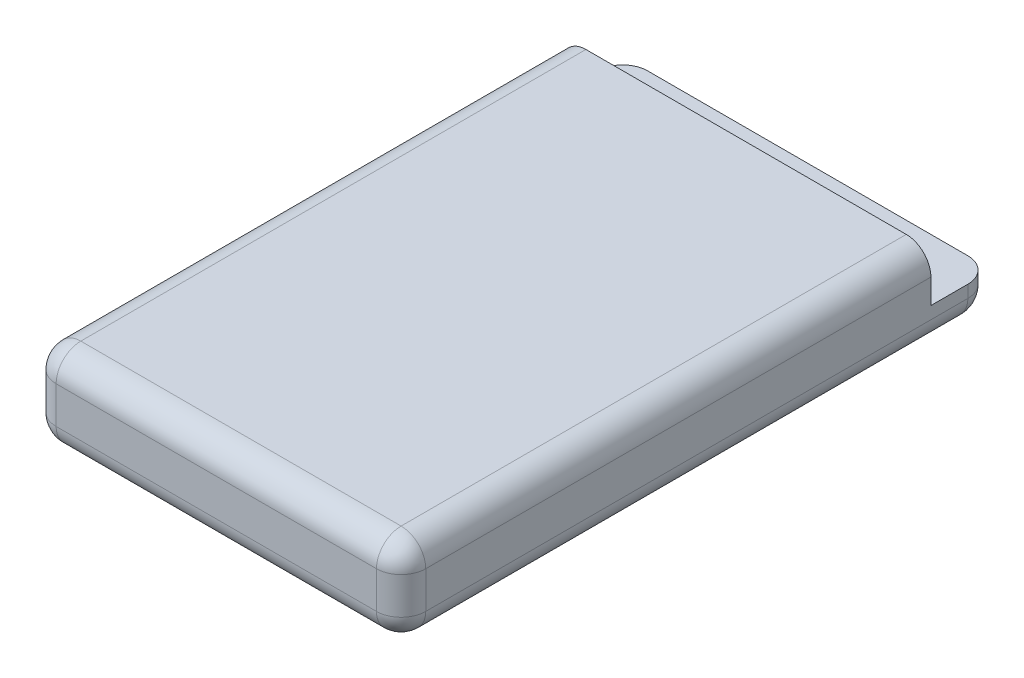
ISO-10303-21;
HEADER;
FILE_DESCRIPTION(('STEP AP214'),'2;1');
FILE_NAME('part.step','',(''),(''),'','','');
FILE_SCHEMA(('AUTOMOTIVE_DESIGN { 1 0 10303 214 1 1 1 1 }'));
ENDSEC;
DATA;
#1=APPLICATION_CONTEXT('core data for automotive mechanical design processes');
#2=APPLICATION_PROTOCOL_DEFINITION('international standard','automotive_design',2000,#1);
#3=PRODUCT_CONTEXT('',#1,'mechanical');
#4=PRODUCT('Part','Part','',(#3));
#5=PRODUCT_RELATED_PRODUCT_CATEGORY('part','',(#4));
#6=PRODUCT_DEFINITION_FORMATION('','',#4);
#7=PRODUCT_DEFINITION_CONTEXT('part definition',#1,'design');
#8=PRODUCT_DEFINITION('design','',#6,#7);
#9=PRODUCT_DEFINITION_SHAPE('','',#8);
#10=(LENGTH_UNIT() NAMED_UNIT(*) SI_UNIT(.MILLI.,.METRE.));
#11=(NAMED_UNIT(*) PLANE_ANGLE_UNIT() SI_UNIT($,.RADIAN.));
#12=(NAMED_UNIT(*) SI_UNIT($,.STERADIAN.) SOLID_ANGLE_UNIT());
#13=UNCERTAINTY_MEASURE_WITH_UNIT(LENGTH_MEASURE(1.E-05),#10,'distance_accuracy_value','');
#14=(GEOMETRIC_REPRESENTATION_CONTEXT(3) GLOBAL_UNCERTAINTY_ASSIGNED_CONTEXT((#13)) GLOBAL_UNIT_ASSIGNED_CONTEXT((#10,
#11,#12)) REPRESENTATION_CONTEXT('',''));
#15=CARTESIAN_POINT('',(0.,0.,0.));
#16=DIRECTION('',(0.,0.,1.));
#17=DIRECTION('',(1.,0.,0.));
#18=AXIS2_PLACEMENT_3D('',#15,#16,#17);
#19=CARTESIAN_POINT('',(-15.,7.,-24.));
#20=DIRECTION('',(0.,0.,1.));
#21=DIRECTION('',(1.,0.,0.));
#22=AXIS2_PLACEMENT_3D('',#19,#20,#21);
#23=PLANE('',#22);
#24=DIRECTION('',(1.,0.,0.));
#25=VECTOR('',#24,1.);
#26=CARTESIAN_POINT('',(0.,3.,-24.));
#27=LINE('',#26,#25);
#28=CARTESIAN_POINT('',(-13.,3.,-24.));
#29=VERTEX_POINT('',#28);
#30=CARTESIAN_POINT('',(13.,3.,-24.));
#31=VERTEX_POINT('',#30);
#32=EDGE_CURVE('E57',#29,#31,#27,.T.);
#33=ORIENTED_EDGE('',*,*,#32,.T.);
#34=DIRECTION('',(0.,-1.,0.));
#35=VECTOR('',#34,1.);
#36=CARTESIAN_POINT('',(13.,7.,-24.));
#37=LINE('',#36,#35);
#38=CARTESIAN_POINT('',(13.,2.,-24.));
#39=VERTEX_POINT('',#38);
#40=EDGE_CURVE('E156',#31,#39,#37,.T.);
#41=ORIENTED_EDGE('',*,*,#40,.T.);
#42=DIRECTION('',(-1.,0.,0.));
#43=VECTOR('',#42,1.);
#44=CARTESIAN_POINT('',(-15.,2.,-24.));
#45=LINE('',#44,#43);
#46=CARTESIAN_POINT('',(-13.,2.,-24.));
#47=VERTEX_POINT('',#46);
#48=EDGE_CURVE('E184',#39,#47,#45,.T.);
#49=ORIENTED_EDGE('',*,*,#48,.T.);
#50=DIRECTION('',(0.,-1.,0.));
#51=VECTOR('',#50,1.);
#52=CARTESIAN_POINT('',(-13.,7.,-24.));
#53=LINE('',#52,#51);
#54=EDGE_CURVE('E159',#47,#29,#53,.F.);
#55=ORIENTED_EDGE('',*,*,#54,.T.);
#56=EDGE_LOOP('',(#33,#41,#49,#55));
#57=FACE_BOUND('',#56,.T.);
#58=ADVANCED_FACE('F42',(#57),#23,.F.);
#59=CARTESIAN_POINT('',(13.,7.,-22.));
#60=DIRECTION('',(0.,-1.,0.));
#61=DIRECTION('',(0.,0.,-1.));
#62=AXIS2_PLACEMENT_3D('',#59,#60,#61);
#63=CYLINDRICAL_SURFACE('',#62,2.);
#64=ORIENTED_EDGE('',*,*,#40,.F.);
#65=CARTESIAN_POINT('',(13.,3.,-22.));
#66=DIRECTION('',(0.,1.,0.));
#67=DIRECTION('',(0.,0.,1.));
#68=AXIS2_PLACEMENT_3D('',#65,#66,#67);
#69=CIRCLE('',#68,2.);
#70=CARTESIAN_POINT('',(15.,3.,-22.));
#71=VERTEX_POINT('',#70);
#72=EDGE_CURVE('E142',#31,#71,#69,.F.);
#73=ORIENTED_EDGE('',*,*,#72,.T.);
#74=DIRECTION('',(0.,-1.,0.));
#75=VECTOR('',#74,1.);
#76=CARTESIAN_POINT('',(15.,7.,-22.));
#77=LINE('',#76,#75);
#78=CARTESIAN_POINT('',(15.,2.,-22.));
#79=VERTEX_POINT('',#78);
#80=EDGE_CURVE('E168',#79,#71,#77,.F.);
#81=ORIENTED_EDGE('',*,*,#80,.F.);
#82=CARTESIAN_POINT('',(13.,2.,-22.));
#83=DIRECTION('',(0.,1.,0.));
#84=DIRECTION('',(0.,0.,1.));
#85=AXIS2_PLACEMENT_3D('',#82,#83,#84);
#86=CIRCLE('',#85,2.);
#87=EDGE_CURVE('E165',#79,#39,#86,.T.);
#88=ORIENTED_EDGE('',*,*,#87,.T.);
#89=EDGE_LOOP('',(#64,#73,#81,#88));
#90=FACE_BOUND('',#89,.T.);
#91=ADVANCED_FACE('F163',(#90),#63,.T.);
#92=CARTESIAN_POINT('',(-13.,7.,-22.));
#93=DIRECTION('',(0.,-1.,0.));
#94=DIRECTION('',(0.,0.,-1.));
#95=AXIS2_PLACEMENT_3D('',#92,#93,#94);
#96=CYLINDRICAL_SURFACE('',#95,2.);
#97=DIRECTION('',(0.,-1.,0.));
#98=VECTOR('',#97,1.);
#99=CARTESIAN_POINT('',(-15.,7.,-22.));
#100=LINE('',#99,#98);
#101=CARTESIAN_POINT('',(-15.,3.,-22.));
#102=VERTEX_POINT('',#101);
#103=CARTESIAN_POINT('',(-15.,2.,-22.));
#104=VERTEX_POINT('',#103);
#105=EDGE_CURVE('E181',#102,#104,#100,.T.);
#106=ORIENTED_EDGE('',*,*,#105,.F.);
#107=CARTESIAN_POINT('',(-13.,3.,-22.));
#108=DIRECTION('',(0.,1.,0.));
#109=DIRECTION('',(0.,0.,1.));
#110=AXIS2_PLACEMENT_3D('',#107,#108,#109);
#111=CIRCLE('',#110,2.);
#112=EDGE_CURVE('E50',#102,#29,#111,.F.);
#113=ORIENTED_EDGE('',*,*,#112,.T.);
#114=ORIENTED_EDGE('',*,*,#54,.F.);
#115=CARTESIAN_POINT('',(-13.,2.,-22.));
#116=DIRECTION('',(0.,1.,0.));
#117=DIRECTION('',(0.,0.,1.));
#118=AXIS2_PLACEMENT_3D('',#115,#116,#117);
#119=CIRCLE('',#118,2.);
#120=EDGE_CURVE('E189',#47,#104,#119,.T.);
#121=ORIENTED_EDGE('',*,*,#120,.T.);
#122=EDGE_LOOP('',(#106,#113,#114,#121));
#123=FACE_BOUND('',#122,.T.);
#124=ADVANCED_FACE('F201',(#123),#96,.T.);
#125=CARTESIAN_POINT('',(15.,7.,24.));
#126=DIRECTION('',(-1.,0.,0.));
#127=DIRECTION('',(0.,0.,1.));
#128=AXIS2_PLACEMENT_3D('',#125,#126,#127);
#129=PLANE('',#128);
#130=DIRECTION('',(0.,0.,-1.));
#131=VECTOR('',#130,1.);
#132=CARTESIAN_POINT('',(15.,3.,24.));
#133=LINE('',#132,#131);
#134=CARTESIAN_POINT('',(15.,3.,-19.));
#135=VERTEX_POINT('',#134);
#136=EDGE_CURVE('E146',#135,#71,#133,.T.);
#137=ORIENTED_EDGE('',*,*,#136,.F.);
#138=DIRECTION('',(0.,1.,0.));
#139=VECTOR('',#138,1.);
#140=CARTESIAN_POINT('',(15.,7.,-19.));
#141=LINE('',#140,#139);
#142=CARTESIAN_POINT('',(15.,5.,-19.));
#143=VERTEX_POINT('',#142);
#144=EDGE_CURVE('E213',#135,#143,#141,.T.);
#145=ORIENTED_EDGE('',*,*,#144,.T.);
#146=DIRECTION('',(0.,0.,-1.));
#147=VECTOR('',#146,1.);
#148=CARTESIAN_POINT('',(15.,5.,24.));
#149=LINE('',#148,#147);
#150=CARTESIAN_POINT('',(15.,5.,22.));
#151=VERTEX_POINT('',#150);
#152=EDGE_CURVE('E242',#143,#151,#149,.F.);
#153=ORIENTED_EDGE('',*,*,#152,.T.);
#154=DIRECTION('',(0.,-1.,0.));
#155=VECTOR('',#154,1.);
#156=CARTESIAN_POINT('',(15.,7.,22.));
#157=LINE('',#156,#155);
#158=CARTESIAN_POINT('',(15.,2.,22.));
#159=VERTEX_POINT('',#158);
#160=EDGE_CURVE('E166',#151,#159,#157,.T.);
#161=ORIENTED_EDGE('',*,*,#160,.T.);
#162=DIRECTION('',(0.,0.,-1.));
#163=VECTOR('',#162,1.);
#164=CARTESIAN_POINT('',(15.,2.,-24.));
#165=LINE('',#164,#163);
#166=EDGE_CURVE('E244',#159,#79,#165,.T.);
#167=ORIENTED_EDGE('',*,*,#166,.T.);
#168=ORIENTED_EDGE('',*,*,#80,.T.);
#169=EDGE_LOOP('',(#137,#145,#153,#161,#167,#168));
#170=FACE_BOUND('',#169,.T.);
#171=ADVANCED_FACE('F317',(#170),#129,.F.);
#172=CARTESIAN_POINT('',(-15.,7.,24.));
#173=DIRECTION('',(1.,0.,0.));
#174=DIRECTION('',(0.,0.,-1.));
#175=AXIS2_PLACEMENT_3D('',#172,#173,#174);
#176=PLANE('',#175);
#177=DIRECTION('',(0.,0.,1.));
#178=VECTOR('',#177,1.);
#179=CARTESIAN_POINT('',(-15.,5.,24.));
#180=LINE('',#179,#178);
#181=CARTESIAN_POINT('',(-15.,5.,22.));
#182=VERTEX_POINT('',#181);
#183=CARTESIAN_POINT('',(-15.,5.,-19.));
#184=VERTEX_POINT('',#183);
#185=EDGE_CURVE('E232',#182,#184,#180,.F.);
#186=ORIENTED_EDGE('',*,*,#185,.T.);
#187=DIRECTION('',(0.,-1.,0.));
#188=VECTOR('',#187,1.);
#189=CARTESIAN_POINT('',(-15.,7.,-19.));
#190=LINE('',#189,#188);
#191=CARTESIAN_POINT('',(-15.,3.,-19.));
#192=VERTEX_POINT('',#191);
#193=EDGE_CURVE('E197',#184,#192,#190,.T.);
#194=ORIENTED_EDGE('',*,*,#193,.T.);
#195=DIRECTION('',(0.,0.,1.));
#196=VECTOR('',#195,1.);
#197=CARTESIAN_POINT('',(-15.,3.,24.));
#198=LINE('',#197,#196);
#199=EDGE_CURVE('E151',#102,#192,#198,.T.);
#200=ORIENTED_EDGE('',*,*,#199,.F.);
#201=ORIENTED_EDGE('',*,*,#105,.T.);
#202=DIRECTION('',(0.,0.,1.));
#203=VECTOR('',#202,1.);
#204=CARTESIAN_POINT('',(-15.,2.,24.));
#205=LINE('',#204,#203);
#206=CARTESIAN_POINT('',(-15.,2.,22.));
#207=VERTEX_POINT('',#206);
#208=EDGE_CURVE('E234',#104,#207,#205,.T.);
#209=ORIENTED_EDGE('',*,*,#208,.T.);
#210=DIRECTION('',(0.,-1.,0.));
#211=VECTOR('',#210,1.);
#212=CARTESIAN_POINT('',(-15.,7.,22.));
#213=LINE('',#212,#211);
#214=EDGE_CURVE('E179',#207,#182,#213,.F.);
#215=ORIENTED_EDGE('',*,*,#214,.T.);
#216=EDGE_LOOP('',(#186,#194,#200,#201,#209,#215));
#217=FACE_BOUND('',#216,.T.);
#218=ADVANCED_FACE('F207',(#217),#176,.F.);
#219=CARTESIAN_POINT('',(-15.,7.,24.));
#220=DIRECTION('',(0.,0.,-1.));
#221=DIRECTION('',(-1.,0.,0.));
#222=AXIS2_PLACEMENT_3D('',#219,#220,#221);
#223=PLANE('',#222);
#224=DIRECTION('',(1.,0.,0.));
#225=VECTOR('',#224,1.);
#226=CARTESIAN_POINT('',(15.,2.,24.));
#227=LINE('',#226,#225);
#228=CARTESIAN_POINT('',(-13.,2.,24.));
#229=VERTEX_POINT('',#228);
#230=CARTESIAN_POINT('',(13.,2.,24.));
#231=VERTEX_POINT('',#230);
#232=EDGE_CURVE('E239',#229,#231,#227,.T.);
#233=ORIENTED_EDGE('',*,*,#232,.T.);
#234=DIRECTION('',(0.,-1.,0.));
#235=VECTOR('',#234,1.);
#236=CARTESIAN_POINT('',(13.,7.,24.));
#237=LINE('',#236,#235);
#238=CARTESIAN_POINT('',(13.,5.,24.));
#239=VERTEX_POINT('',#238);
#240=EDGE_CURVE('E177',#231,#239,#237,.F.);
#241=ORIENTED_EDGE('',*,*,#240,.T.);
#242=DIRECTION('',(1.,0.,0.));
#243=VECTOR('',#242,1.);
#244=CARTESIAN_POINT('',(-15.,5.,24.));
#245=LINE('',#244,#243);
#246=CARTESIAN_POINT('',(-13.,5.,24.));
#247=VERTEX_POINT('',#246);
#248=EDGE_CURVE('E236',#239,#247,#245,.F.);
#249=ORIENTED_EDGE('',*,*,#248,.T.);
#250=DIRECTION('',(0.,-1.,0.));
#251=VECTOR('',#250,1.);
#252=CARTESIAN_POINT('',(-13.,7.,24.));
#253=LINE('',#252,#251);
#254=EDGE_CURVE('E175',#247,#229,#253,.T.);
#255=ORIENTED_EDGE('',*,*,#254,.T.);
#256=EDGE_LOOP('',(#233,#241,#249,#255));
#257=FACE_BOUND('',#256,.T.);
#258=ADVANCED_FACE('F370',(#257),#223,.F.);
#259=CARTESIAN_POINT('',(0.,7.,0.));
#260=DIRECTION('',(0.,-1.,0.));
#261=DIRECTION('',(0.,0.,-1.));
#262=AXIS2_PLACEMENT_3D('',#259,#260,#261);
#263=PLANE('',#262);
#264=DIRECTION('',(0.,0.,-1.));
#265=VECTOR('',#264,1.);
#266=CARTESIAN_POINT('',(13.,7.,0.));
#267=LINE('',#266,#265);
#268=CARTESIAN_POINT('',(13.,7.,22.));
#269=VERTEX_POINT('',#268);
#270=CARTESIAN_POINT('',(13.,7.,-19.));
#271=VERTEX_POINT('',#270);
#272=EDGE_CURVE('E247',#269,#271,#267,.T.);
#273=ORIENTED_EDGE('',*,*,#272,.T.);
#274=DIRECTION('',(1.,0.,0.));
#275=VECTOR('',#274,1.);
#276=CARTESIAN_POINT('',(0.,7.,-19.));
#277=LINE('',#276,#275);
#278=CARTESIAN_POINT('',(-13.,7.,-19.));
#279=VERTEX_POINT('',#278);
#280=EDGE_CURVE('E210',#279,#271,#277,.T.);
#281=ORIENTED_EDGE('',*,*,#280,.F.);
#282=DIRECTION('',(0.,0.,1.));
#283=VECTOR('',#282,1.);
#284=CARTESIAN_POINT('',(-13.,7.,0.));
#285=LINE('',#284,#283);
#286=CARTESIAN_POINT('',(-13.,7.,22.));
#287=VERTEX_POINT('',#286);
#288=EDGE_CURVE('E250',#279,#287,#285,.T.);
#289=ORIENTED_EDGE('',*,*,#288,.T.);
#290=DIRECTION('',(1.,0.,0.));
#291=VECTOR('',#290,1.);
#292=CARTESIAN_POINT('',(0.,7.,22.));
#293=LINE('',#292,#291);
#294=EDGE_CURVE('E252',#287,#269,#293,.T.);
#295=ORIENTED_EDGE('',*,*,#294,.T.);
#296=EDGE_LOOP('',(#273,#281,#289,#295));
#297=FACE_BOUND('',#296,.T.);
#298=ADVANCED_FACE('F377',(#297),#263,.F.);
#299=CARTESIAN_POINT('',(0.,0.,0.));
#300=DIRECTION('',(0.,-1.,0.));
#301=DIRECTION('',(0.,0.,-1.));
#302=AXIS2_PLACEMENT_3D('',#299,#300,#301);
#303=PLANE('',#302);
#304=DIRECTION('',(0.,0.,1.));
#305=VECTOR('',#304,1.);
#306=CARTESIAN_POINT('',(-13.,0.,-24.));
#307=LINE('',#306,#305);
#308=CARTESIAN_POINT('',(-13.,0.,22.));
#309=VERTEX_POINT('',#308);
#310=CARTESIAN_POINT('',(-13.,0.,-22.));
#311=VERTEX_POINT('',#310);
#312=EDGE_CURVE('E226',#309,#311,#307,.F.);
#313=ORIENTED_EDGE('',*,*,#312,.T.);
#314=DIRECTION('',(-1.,0.,0.));
#315=VECTOR('',#314,1.);
#316=CARTESIAN_POINT('',(15.,0.,-22.));
#317=LINE('',#316,#315);
#318=CARTESIAN_POINT('',(13.,0.,-22.));
#319=VERTEX_POINT('',#318);
#320=EDGE_CURVE('E229',#311,#319,#317,.F.);
#321=ORIENTED_EDGE('',*,*,#320,.T.);
#322=DIRECTION('',(0.,0.,-1.));
#323=VECTOR('',#322,1.);
#324=CARTESIAN_POINT('',(13.,0.,24.));
#325=LINE('',#324,#323);
#326=CARTESIAN_POINT('',(13.,0.,22.));
#327=VERTEX_POINT('',#326);
#328=EDGE_CURVE('E220',#319,#327,#325,.F.);
#329=ORIENTED_EDGE('',*,*,#328,.T.);
#330=DIRECTION('',(1.,0.,0.));
#331=VECTOR('',#330,1.);
#332=CARTESIAN_POINT('',(-15.,0.,22.));
#333=LINE('',#332,#331);
#334=EDGE_CURVE('E223',#327,#309,#333,.F.);
#335=ORIENTED_EDGE('',*,*,#334,.T.);
#336=EDGE_LOOP('',(#313,#321,#329,#335));
#337=FACE_BOUND('',#336,.T.);
#338=ADVANCED_FACE('F286',(#337),#303,.T.);
#339=CARTESIAN_POINT('',(-15.,2.,22.));
#340=DIRECTION('',(-1.,0.,0.));
#341=DIRECTION('',(0.,0.,1.));
#342=AXIS2_PLACEMENT_3D('',#339,#340,#341);
#343=CYLINDRICAL_SURFACE('',#342,2.);
#344=ORIENTED_EDGE('',*,*,#334,.F.);
#345=CARTESIAN_POINT('',(13.,2.,22.));
#346=DIRECTION('',(-1.,0.,0.));
#347=DIRECTION('',(0.,0.,1.));
#348=AXIS2_PLACEMENT_3D('',#345,#346,#347);
#349=CIRCLE('',#348,2.);
#350=EDGE_CURVE('E274',#327,#231,#349,.T.);
#351=ORIENTED_EDGE('',*,*,#350,.T.);
#352=ORIENTED_EDGE('',*,*,#232,.F.);
#353=CARTESIAN_POINT('',(-13.,2.,22.));
#354=DIRECTION('',(-1.,0.,0.));
#355=DIRECTION('',(0.,0.,1.));
#356=AXIS2_PLACEMENT_3D('',#353,#354,#355);
#357=CIRCLE('',#356,2.);
#358=EDGE_CURVE('E272',#229,#309,#357,.F.);
#359=ORIENTED_EDGE('',*,*,#358,.T.);
#360=EDGE_LOOP('',(#344,#351,#352,#359));
#361=FACE_BOUND('',#360,.T.);
#362=ADVANCED_FACE('F329',(#361),#343,.T.);
#363=CARTESIAN_POINT('',(13.,2.,24.));
#364=DIRECTION('',(0.,0.,1.));
#365=DIRECTION('',(1.,0.,0.));
#366=AXIS2_PLACEMENT_3D('',#363,#364,#365);
#367=CYLINDRICAL_SURFACE('',#366,2.);
#368=ORIENTED_EDGE('',*,*,#328,.F.);
#369=CARTESIAN_POINT('',(13.,2.,-22.));
#370=DIRECTION('',(0.,0.,1.));
#371=DIRECTION('',(1.,0.,0.));
#372=AXIS2_PLACEMENT_3D('',#369,#370,#371);
#373=CIRCLE('',#372,2.);
#374=EDGE_CURVE('E264',#319,#79,#373,.T.);
#375=ORIENTED_EDGE('',*,*,#374,.T.);
#376=ORIENTED_EDGE('',*,*,#166,.F.);
#377=CARTESIAN_POINT('',(13.,2.,22.));
#378=DIRECTION('',(0.,0.,1.));
#379=DIRECTION('',(1.,0.,0.));
#380=AXIS2_PLACEMENT_3D('',#377,#378,#379);
#381=CIRCLE('',#380,2.);
#382=EDGE_CURVE('E262',#159,#327,#381,.F.);
#383=ORIENTED_EDGE('',*,*,#382,.T.);
#384=EDGE_LOOP('',(#368,#375,#376,#383));
#385=FACE_BOUND('',#384,.T.);
#386=ADVANCED_FACE('F326',(#385),#367,.T.);
#387=CARTESIAN_POINT('',(-13.,2.,24.));
#388=DIRECTION('',(0.,0.,-1.));
#389=DIRECTION('',(-1.,0.,0.));
#390=AXIS2_PLACEMENT_3D('',#387,#388,#389);
#391=CYLINDRICAL_SURFACE('',#390,2.);
#392=ORIENTED_EDGE('',*,*,#208,.F.);
#393=CARTESIAN_POINT('',(-13.,2.,-22.));
#394=DIRECTION('',(0.,0.,-1.));
#395=DIRECTION('',(-1.,0.,0.));
#396=AXIS2_PLACEMENT_3D('',#393,#394,#395);
#397=CIRCLE('',#396,2.);
#398=EDGE_CURVE('E170',#104,#311,#397,.F.);
#399=ORIENTED_EDGE('',*,*,#398,.T.);
#400=ORIENTED_EDGE('',*,*,#312,.F.);
#401=CARTESIAN_POINT('',(-13.,2.,22.));
#402=DIRECTION('',(0.,0.,-1.));
#403=DIRECTION('',(-1.,0.,0.));
#404=AXIS2_PLACEMENT_3D('',#401,#402,#403);
#405=CIRCLE('',#404,2.);
#406=EDGE_CURVE('E65',#309,#207,#405,.T.);
#407=ORIENTED_EDGE('',*,*,#406,.T.);
#408=EDGE_LOOP('',(#392,#399,#400,#407));
#409=FACE_BOUND('',#408,.T.);
#410=ADVANCED_FACE('F280',(#409),#391,.T.);
#411=CARTESIAN_POINT('',(-15.,2.,-22.));
#412=DIRECTION('',(1.,0.,0.));
#413=DIRECTION('',(0.,0.,-1.));
#414=AXIS2_PLACEMENT_3D('',#411,#412,#413);
#415=CYLINDRICAL_SURFACE('',#414,2.);
#416=ORIENTED_EDGE('',*,*,#48,.F.);
#417=CARTESIAN_POINT('',(13.,2.,-22.));
#418=DIRECTION('',(1.,0.,0.));
#419=DIRECTION('',(0.,0.,-1.));
#420=AXIS2_PLACEMENT_3D('',#417,#418,#419);
#421=CIRCLE('',#420,2.);
#422=EDGE_CURVE('E260',#39,#319,#421,.F.);
#423=ORIENTED_EDGE('',*,*,#422,.T.);
#424=ORIENTED_EDGE('',*,*,#320,.F.);
#425=CARTESIAN_POINT('',(-13.,2.,-22.));
#426=DIRECTION('',(1.,0.,0.));
#427=DIRECTION('',(0.,0.,-1.));
#428=AXIS2_PLACEMENT_3D('',#425,#426,#427);
#429=CIRCLE('',#428,2.);
#430=EDGE_CURVE('E258',#311,#47,#429,.T.);
#431=ORIENTED_EDGE('',*,*,#430,.T.);
#432=EDGE_LOOP('',(#416,#423,#424,#431));
#433=FACE_BOUND('',#432,.T.);
#434=ADVANCED_FACE('F290',(#433),#415,.T.);
#435=CARTESIAN_POINT('',(-13.,5.,0.));
#436=DIRECTION('',(0.,0.,1.));
#437=DIRECTION('',(1.,0.,0.));
#438=AXIS2_PLACEMENT_3D('',#435,#436,#437);
#439=CYLINDRICAL_SURFACE('',#438,2.);
#440=CARTESIAN_POINT('',(-13.,5.,-19.));
#441=DIRECTION('',(0.,0.,1.));
#442=DIRECTION('',(1.,0.,0.));
#443=AXIS2_PLACEMENT_3D('',#440,#441,#442);
#444=CIRCLE('',#443,2.);
#445=EDGE_CURVE('E216',#184,#279,#444,.F.);
#446=ORIENTED_EDGE('',*,*,#445,.F.);
#447=ORIENTED_EDGE('',*,*,#185,.F.);
#448=CARTESIAN_POINT('',(-13.,5.,22.));
#449=DIRECTION('',(0.,0.,1.));
#450=DIRECTION('',(1.,0.,0.));
#451=AXIS2_PLACEMENT_3D('',#448,#449,#450);
#452=CIRCLE('',#451,2.);
#453=EDGE_CURVE('E276',#182,#287,#452,.F.);
#454=ORIENTED_EDGE('',*,*,#453,.T.);
#455=ORIENTED_EDGE('',*,*,#288,.F.);
#456=EDGE_LOOP('',(#446,#447,#454,#455));
#457=FACE_BOUND('',#456,.T.);
#458=ADVANCED_FACE('F323',(#457),#439,.T.);
#459=CARTESIAN_POINT('',(13.,5.,0.));
#460=DIRECTION('',(0.,0.,-1.));
#461=DIRECTION('',(-1.,0.,0.));
#462=AXIS2_PLACEMENT_3D('',#459,#460,#461);
#463=CYLINDRICAL_SURFACE('',#462,2.);
#464=CARTESIAN_POINT('',(13.,5.,-19.));
#465=DIRECTION('',(0.,0.,1.));
#466=DIRECTION('',(1.,0.,0.));
#467=AXIS2_PLACEMENT_3D('',#464,#465,#466);
#468=CIRCLE('',#467,2.);
#469=EDGE_CURVE('E11',#271,#143,#468,.F.);
#470=ORIENTED_EDGE('',*,*,#469,.F.);
#471=ORIENTED_EDGE('',*,*,#272,.F.);
#472=CARTESIAN_POINT('',(13.,5.,22.));
#473=DIRECTION('',(0.,0.,-1.));
#474=DIRECTION('',(-1.,0.,0.));
#475=AXIS2_PLACEMENT_3D('',#472,#473,#474);
#476=CIRCLE('',#475,2.);
#477=EDGE_CURVE('E255',#269,#151,#476,.T.);
#478=ORIENTED_EDGE('',*,*,#477,.T.);
#479=ORIENTED_EDGE('',*,*,#152,.F.);
#480=EDGE_LOOP('',(#470,#471,#478,#479));
#481=FACE_BOUND('',#480,.T.);
#482=ADVANCED_FACE('F338',(#481),#463,.T.);
#483=CARTESIAN_POINT('',(0.,5.,22.));
#484=DIRECTION('',(1.,0.,0.));
#485=DIRECTION('',(0.,0.,-1.));
#486=AXIS2_PLACEMENT_3D('',#483,#484,#485);
#487=CYLINDRICAL_SURFACE('',#486,2.);
#488=ORIENTED_EDGE('',*,*,#248,.F.);
#489=CARTESIAN_POINT('',(13.,5.,22.));
#490=DIRECTION('',(1.,0.,0.));
#491=DIRECTION('',(0.,0.,-1.));
#492=AXIS2_PLACEMENT_3D('',#489,#490,#491);
#493=CIRCLE('',#492,2.);
#494=EDGE_CURVE('E269',#239,#269,#493,.F.);
#495=ORIENTED_EDGE('',*,*,#494,.T.);
#496=ORIENTED_EDGE('',*,*,#294,.F.);
#497=CARTESIAN_POINT('',(-13.,5.,22.));
#498=DIRECTION('',(1.,0.,0.));
#499=DIRECTION('',(0.,0.,-1.));
#500=AXIS2_PLACEMENT_3D('',#497,#498,#499);
#501=CIRCLE('',#500,2.);
#502=EDGE_CURVE('E266',#287,#247,#501,.T.);
#503=ORIENTED_EDGE('',*,*,#502,.T.);
#504=EDGE_LOOP('',(#488,#495,#496,#503));
#505=FACE_BOUND('',#504,.T.);
#506=ADVANCED_FACE('F334',(#505),#487,.T.);
#507=CARTESIAN_POINT('',(13.,2.,-22.));
#508=DIRECTION('',(0.,0.,1.));
#509=DIRECTION('',(1.,0.,0.));
#510=AXIS2_PLACEMENT_3D('',#507,#508,#509);
#511=SPHERICAL_SURFACE('',#510,2.);
#512=ORIENTED_EDGE('',*,*,#374,.F.);
#513=ORIENTED_EDGE('',*,*,#422,.F.);
#514=ORIENTED_EDGE('',*,*,#87,.F.);
#515=EDGE_LOOP('',(#512,#513,#514));
#516=FACE_BOUND('',#515,.T.);
#517=ADVANCED_FACE('F337',(#516),#511,.T.);
#518=CARTESIAN_POINT('',(13.,2.,22.));
#519=DIRECTION('',(0.,0.,1.));
#520=DIRECTION('',(1.,0.,0.));
#521=AXIS2_PLACEMENT_3D('',#518,#519,#520);
#522=SPHERICAL_SURFACE('',#521,2.);
#523=ORIENTED_EDGE('',*,*,#350,.F.);
#524=ORIENTED_EDGE('',*,*,#382,.F.);
#525=CARTESIAN_POINT('',(13.,2.,22.));
#526=DIRECTION('',(0.,1.,0.));
#527=DIRECTION('',(0.,0.,1.));
#528=AXIS2_PLACEMENT_3D('',#525,#526,#527);
#529=CIRCLE('',#528,2.);
#530=EDGE_CURVE('E185',#231,#159,#529,.T.);
#531=ORIENTED_EDGE('',*,*,#530,.F.);
#532=EDGE_LOOP('',(#523,#524,#531));
#533=FACE_BOUND('',#532,.T.);
#534=ADVANCED_FACE('F347',(#533),#522,.T.);
#535=CARTESIAN_POINT('',(13.,7.,22.));
#536=DIRECTION('',(0.,-1.,0.));
#537=DIRECTION('',(0.,0.,-1.));
#538=AXIS2_PLACEMENT_3D('',#535,#536,#537);
#539=CYLINDRICAL_SURFACE('',#538,2.);
#540=ORIENTED_EDGE('',*,*,#530,.T.);
#541=ORIENTED_EDGE('',*,*,#160,.F.);
#542=CARTESIAN_POINT('',(13.,5.,22.));
#543=DIRECTION('',(0.,1.,0.));
#544=DIRECTION('',(0.,0.,1.));
#545=AXIS2_PLACEMENT_3D('',#542,#543,#544);
#546=CIRCLE('',#545,2.);
#547=EDGE_CURVE('E186',#239,#151,#546,.T.);
#548=ORIENTED_EDGE('',*,*,#547,.F.);
#549=ORIENTED_EDGE('',*,*,#240,.F.);
#550=EDGE_LOOP('',(#540,#541,#548,#549));
#551=FACE_BOUND('',#550,.T.);
#552=ADVANCED_FACE('F303',(#551),#539,.T.);
#553=CARTESIAN_POINT('',(13.,5.,22.));
#554=DIRECTION('',(0.,0.,1.));
#555=DIRECTION('',(1.,0.,0.));
#556=AXIS2_PLACEMENT_3D('',#553,#554,#555);
#557=SPHERICAL_SURFACE('',#556,2.);
#558=ORIENTED_EDGE('',*,*,#547,.T.);
#559=ORIENTED_EDGE('',*,*,#477,.F.);
#560=ORIENTED_EDGE('',*,*,#494,.F.);
#561=EDGE_LOOP('',(#558,#559,#560));
#562=FACE_BOUND('',#561,.T.);
#563=ADVANCED_FACE('F295',(#562),#557,.T.);
#564=CARTESIAN_POINT('',(-13.,2.,-22.));
#565=DIRECTION('',(0.,0.,1.));
#566=DIRECTION('',(1.,0.,0.));
#567=AXIS2_PLACEMENT_3D('',#564,#565,#566);
#568=SPHERICAL_SURFACE('',#567,2.);
#569=ORIENTED_EDGE('',*,*,#430,.F.);
#570=ORIENTED_EDGE('',*,*,#398,.F.);
#571=ORIENTED_EDGE('',*,*,#120,.F.);
#572=EDGE_LOOP('',(#569,#570,#571));
#573=FACE_BOUND('',#572,.T.);
#574=ADVANCED_FACE('F293',(#573),#568,.T.);
#575=CARTESIAN_POINT('',(-13.,2.,22.));
#576=DIRECTION('',(0.,0.,1.));
#577=DIRECTION('',(1.,0.,0.));
#578=AXIS2_PLACEMENT_3D('',#575,#576,#577);
#579=SPHERICAL_SURFACE('',#578,2.);
#580=ORIENTED_EDGE('',*,*,#406,.F.);
#581=ORIENTED_EDGE('',*,*,#358,.F.);
#582=CARTESIAN_POINT('',(-13.,2.,22.));
#583=DIRECTION('',(0.,1.,0.));
#584=DIRECTION('',(0.,0.,1.));
#585=AXIS2_PLACEMENT_3D('',#582,#583,#584);
#586=CIRCLE('',#585,2.);
#587=EDGE_CURVE('E194',#207,#229,#586,.T.);
#588=ORIENTED_EDGE('',*,*,#587,.F.);
#589=EDGE_LOOP('',(#580,#581,#588));
#590=FACE_BOUND('',#589,.T.);
#591=ADVANCED_FACE('F44',(#590),#579,.T.);
#592=CARTESIAN_POINT('',(-13.,7.,22.));
#593=DIRECTION('',(0.,-1.,0.));
#594=DIRECTION('',(0.,0.,-1.));
#595=AXIS2_PLACEMENT_3D('',#592,#593,#594);
#596=CYLINDRICAL_SURFACE('',#595,2.);
#597=ORIENTED_EDGE('',*,*,#587,.T.);
#598=ORIENTED_EDGE('',*,*,#254,.F.);
#599=CARTESIAN_POINT('',(-13.,5.,22.));
#600=DIRECTION('',(0.,1.,0.));
#601=DIRECTION('',(0.,0.,1.));
#602=AXIS2_PLACEMENT_3D('',#599,#600,#601);
#603=CIRCLE('',#602,2.);
#604=EDGE_CURVE('E195',#182,#247,#603,.T.);
#605=ORIENTED_EDGE('',*,*,#604,.F.);
#606=ORIENTED_EDGE('',*,*,#214,.F.);
#607=EDGE_LOOP('',(#597,#598,#605,#606));
#608=FACE_BOUND('',#607,.T.);
#609=ADVANCED_FACE('F301',(#608),#596,.T.);
#610=CARTESIAN_POINT('',(-13.,5.,22.));
#611=DIRECTION('',(0.,0.,1.));
#612=DIRECTION('',(1.,0.,0.));
#613=AXIS2_PLACEMENT_3D('',#610,#611,#612);
#614=SPHERICAL_SURFACE('',#613,2.);
#615=ORIENTED_EDGE('',*,*,#502,.F.);
#616=ORIENTED_EDGE('',*,*,#453,.F.);
#617=ORIENTED_EDGE('',*,*,#604,.T.);
#618=EDGE_LOOP('',(#615,#616,#617));
#619=FACE_BOUND('',#618,.T.);
#620=ADVANCED_FACE('F457',(#619),#614,.T.);
#621=CARTESIAN_POINT('',(0.,3.,-19.));
#622=DIRECTION('',(0.,0.,1.));
#623=DIRECTION('',(1.,0.,0.));
#624=AXIS2_PLACEMENT_3D('',#621,#622,#623);
#625=PLANE('',#624);
#626=ORIENTED_EDGE('',*,*,#445,.T.);
#627=ORIENTED_EDGE('',*,*,#280,.T.);
#628=ORIENTED_EDGE('',*,*,#469,.T.);
#629=ORIENTED_EDGE('',*,*,#144,.F.);
#630=DIRECTION('',(1.,0.,0.));
#631=VECTOR('',#630,1.);
#632=CARTESIAN_POINT('',(0.,3.,-19.));
#633=LINE('',#632,#631);
#634=EDGE_CURVE('E160',#192,#135,#633,.T.);
#635=ORIENTED_EDGE('',*,*,#634,.F.);
#636=ORIENTED_EDGE('',*,*,#193,.F.);
#637=EDGE_LOOP('',(#626,#627,#628,#629,#635,#636));
#638=FACE_BOUND('',#637,.T.);
#639=ADVANCED_FACE('F465',(#638),#625,.F.);
#640=CARTESIAN_POINT('',(0.,3.,0.));
#641=DIRECTION('',(0.,1.,0.));
#642=DIRECTION('',(0.,0.,1.));
#643=AXIS2_PLACEMENT_3D('',#640,#641,#642);
#644=PLANE('',#643);
#645=ORIENTED_EDGE('',*,*,#136,.T.);
#646=ORIENTED_EDGE('',*,*,#72,.F.);
#647=ORIENTED_EDGE('',*,*,#32,.F.);
#648=ORIENTED_EDGE('',*,*,#112,.F.);
#649=ORIENTED_EDGE('',*,*,#199,.T.);
#650=ORIENTED_EDGE('',*,*,#634,.T.);
#651=EDGE_LOOP('',(#645,#646,#647,#648,#649,#650));
#652=FACE_BOUND('',#651,.T.);
#653=ADVANCED_FACE('F143',(#652),#644,.T.);
#654=CLOSED_SHELL('',(#58,#91,#124,#171,#218,#258,#298,#338,#362,#386,#410,#434,#458,#482,#506,
#517,#534,#552,#563,#574,#591,#609,#620,#639,#653));
#655=MANIFOLD_SOLID_BREP('B2',#654);
#656=ADVANCED_BREP_SHAPE_REPRESENTATION('',(#18,#655),#14);
#657=SHAPE_DEFINITION_REPRESENTATION(#9,#656);
ENDSEC;
END-ISO-10303-21;
